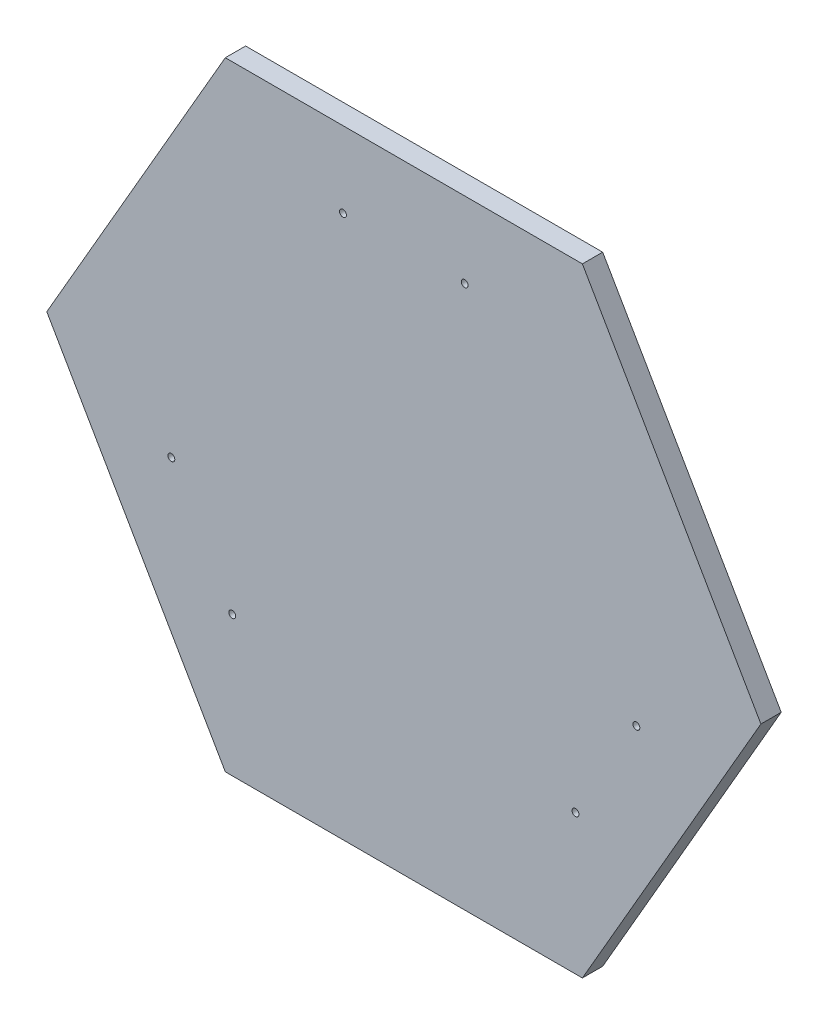
ISO-10303-21;
HEADER;
FILE_DESCRIPTION(('STEP AP214'),'2;1');
FILE_NAME('part.step','',(''),(''),'','','');
FILE_SCHEMA(('AUTOMOTIVE_DESIGN { 1 0 10303 214 1 1 1 1 }'));
ENDSEC;
DATA;
#1=APPLICATION_CONTEXT('core data for automotive mechanical design processes');
#2=APPLICATION_PROTOCOL_DEFINITION('international standard','automotive_design',2000,#1);
#3=PRODUCT_CONTEXT('',#1,'mechanical');
#4=PRODUCT('Part','Part','',(#3));
#5=PRODUCT_RELATED_PRODUCT_CATEGORY('part','',(#4));
#6=PRODUCT_DEFINITION_FORMATION('','',#4);
#7=PRODUCT_DEFINITION_CONTEXT('part definition',#1,'design');
#8=PRODUCT_DEFINITION('design','',#6,#7);
#9=PRODUCT_DEFINITION_SHAPE('','',#8);
#10=(LENGTH_UNIT() NAMED_UNIT(*) SI_UNIT(.MILLI.,.METRE.));
#11=(NAMED_UNIT(*) PLANE_ANGLE_UNIT() SI_UNIT($,.RADIAN.));
#12=(NAMED_UNIT(*) SI_UNIT($,.STERADIAN.) SOLID_ANGLE_UNIT());
#13=UNCERTAINTY_MEASURE_WITH_UNIT(LENGTH_MEASURE(1.E-05),#10,'distance_accuracy_value','');
#14=(GEOMETRIC_REPRESENTATION_CONTEXT(3) GLOBAL_UNCERTAINTY_ASSIGNED_CONTEXT((#13)) GLOBAL_UNIT_ASSIGNED_CONTEXT((#10,
#11,#12)) REPRESENTATION_CONTEXT('',''));
#15=CARTESIAN_POINT('',(0.,0.,0.));
#16=DIRECTION('',(0.,0.,1.));
#17=DIRECTION('',(1.,0.,0.));
#18=AXIS2_PLACEMENT_3D('',#15,#16,#17);
#19=CARTESIAN_POINT('',(87.988181024499,152.4,5.));
#20=DIRECTION('',(0.,-1.,0.));
#21=DIRECTION('',(0.,0.,-1.));
#22=AXIS2_PLACEMENT_3D('',#19,#20,#21);
#23=PLANE('',#22);
#24=DIRECTION('',(-1.,0.,0.));
#25=VECTOR('',#24,1.);
#26=CARTESIAN_POINT('',(87.988181024499,152.4,-5.));
#27=LINE('',#26,#25);
#28=CARTESIAN_POINT('',(87.988181024499,152.4,-5.));
#29=VERTEX_POINT('',#28);
#30=CARTESIAN_POINT('',(-87.9881810244989,152.4,-5.));
#31=VERTEX_POINT('',#30);
#32=EDGE_CURVE('E117',#29,#31,#27,.T.);
#33=ORIENTED_EDGE('',*,*,#32,.T.);
#34=DIRECTION('',(0.,0.,-1.));
#35=VECTOR('',#34,1.);
#36=CARTESIAN_POINT('',(-87.9881810244989,152.4,5.));
#37=LINE('',#36,#35);
#38=CARTESIAN_POINT('',(-87.9881810244989,152.4,5.));
#39=VERTEX_POINT('',#38);
#40=EDGE_CURVE('E11',#39,#31,#37,.T.);
#41=ORIENTED_EDGE('',*,*,#40,.F.);
#42=DIRECTION('',(-1.,0.,0.));
#43=VECTOR('',#42,1.);
#44=CARTESIAN_POINT('',(87.988181024499,152.4,5.));
#45=LINE('',#44,#43);
#46=CARTESIAN_POINT('',(87.988181024499,152.4,5.));
#47=VERTEX_POINT('',#46);
#48=EDGE_CURVE('E128',#47,#39,#45,.T.);
#49=ORIENTED_EDGE('',*,*,#48,.F.);
#50=DIRECTION('',(0.,0.,-1.));
#51=VECTOR('',#50,1.);
#52=CARTESIAN_POINT('',(87.988181024499,152.4,5.));
#53=LINE('',#52,#51);
#54=EDGE_CURVE('E113',#47,#29,#53,.T.);
#55=ORIENTED_EDGE('',*,*,#54,.T.);
#56=EDGE_LOOP('',(#33,#41,#49,#55));
#57=FACE_BOUND('',#56,.T.);
#58=ADVANCED_FACE('F33',(#57),#23,.F.);
#59=CARTESIAN_POINT('',(-87.9881810244989,152.4,5.));
#60=DIRECTION('',(0.866025403784439,-0.5,0.));
#61=DIRECTION('',(0.5,0.866025403784439,0.));
#62=AXIS2_PLACEMENT_3D('',#59,#60,#61);
#63=PLANE('',#62);
#64=DIRECTION('',(-0.5,-0.866025403784439,0.));
#65=VECTOR('',#64,1.);
#66=CARTESIAN_POINT('',(-87.9881810244989,152.4,-5.));
#67=LINE('',#66,#65);
#68=CARTESIAN_POINT('',(-175.976362048998,0.,-5.));
#69=VERTEX_POINT('',#68);
#70=EDGE_CURVE('E120',#31,#69,#67,.T.);
#71=ORIENTED_EDGE('',*,*,#70,.T.);
#72=DIRECTION('',(0.,0.,-1.));
#73=VECTOR('',#72,1.);
#74=CARTESIAN_POINT('',(-175.976362048998,0.,5.));
#75=LINE('',#74,#73);
#76=CARTESIAN_POINT('',(-175.976362048998,0.,5.));
#77=VERTEX_POINT('',#76);
#78=EDGE_CURVE('E41',#77,#69,#75,.T.);
#79=ORIENTED_EDGE('',*,*,#78,.F.);
#80=DIRECTION('',(-0.5,-0.866025403784439,0.));
#81=VECTOR('',#80,1.);
#82=CARTESIAN_POINT('',(-87.9881810244989,152.4,5.));
#83=LINE('',#82,#81);
#84=EDGE_CURVE('E86',#39,#77,#83,.T.);
#85=ORIENTED_EDGE('',*,*,#84,.F.);
#86=ORIENTED_EDGE('',*,*,#40,.T.);
#87=EDGE_LOOP('',(#71,#79,#85,#86));
#88=FACE_BOUND('',#87,.T.);
#89=ADVANCED_FACE('F153',(#88),#63,.F.);
#90=CARTESIAN_POINT('',(-175.976362048998,0.,5.));
#91=DIRECTION('',(0.866025403784439,0.5,0.));
#92=DIRECTION('',(-0.5,0.866025403784439,0.));
#93=AXIS2_PLACEMENT_3D('',#90,#91,#92);
#94=PLANE('',#93);
#95=DIRECTION('',(0.5,-0.866025403784439,0.));
#96=VECTOR('',#95,1.);
#97=CARTESIAN_POINT('',(-175.976362048998,0.,-5.));
#98=LINE('',#97,#96);
#99=CARTESIAN_POINT('',(-87.988181024499,-152.4,-5.));
#100=VERTEX_POINT('',#99);
#101=EDGE_CURVE('E123',#69,#100,#98,.T.);
#102=ORIENTED_EDGE('',*,*,#101,.T.);
#103=DIRECTION('',(0.,0.,-1.));
#104=VECTOR('',#103,1.);
#105=CARTESIAN_POINT('',(-87.988181024499,-152.4,5.));
#106=LINE('',#105,#104);
#107=CARTESIAN_POINT('',(-87.988181024499,-152.4,5.));
#108=VERTEX_POINT('',#107);
#109=EDGE_CURVE('E108',#108,#100,#106,.T.);
#110=ORIENTED_EDGE('',*,*,#109,.F.);
#111=DIRECTION('',(0.5,-0.866025403784439,0.));
#112=VECTOR('',#111,1.);
#113=CARTESIAN_POINT('',(-175.976362048998,0.,5.));
#114=LINE('',#113,#112);
#115=EDGE_CURVE('E99',#77,#108,#114,.T.);
#116=ORIENTED_EDGE('',*,*,#115,.F.);
#117=ORIENTED_EDGE('',*,*,#78,.T.);
#118=EDGE_LOOP('',(#102,#110,#116,#117));
#119=FACE_BOUND('',#118,.T.);
#120=ADVANCED_FACE('F134',(#119),#94,.F.);
#121=CARTESIAN_POINT('',(-87.988181024499,-152.4,5.));
#122=DIRECTION('',(0.,1.,0.));
#123=DIRECTION('',(-1.,0.,0.));
#124=AXIS2_PLACEMENT_3D('',#121,#122,#123);
#125=PLANE('',#124);
#126=DIRECTION('',(1.,0.,0.));
#127=VECTOR('',#126,1.);
#128=CARTESIAN_POINT('',(-87.988181024499,-152.4,-5.));
#129=LINE('',#128,#127);
#130=CARTESIAN_POINT('',(87.9881810244989,-152.4,-5.));
#131=VERTEX_POINT('',#130);
#132=EDGE_CURVE('E107',#100,#131,#129,.T.);
#133=ORIENTED_EDGE('',*,*,#132,.T.);
#134=DIRECTION('',(0.,0.,-1.));
#135=VECTOR('',#134,1.);
#136=CARTESIAN_POINT('',(87.9881810244989,-152.4,5.));
#137=LINE('',#136,#135);
#138=CARTESIAN_POINT('',(87.9881810244989,-152.4,5.));
#139=VERTEX_POINT('',#138);
#140=EDGE_CURVE('E104',#139,#131,#137,.T.);
#141=ORIENTED_EDGE('',*,*,#140,.F.);
#142=DIRECTION('',(1.,0.,0.));
#143=VECTOR('',#142,1.);
#144=CARTESIAN_POINT('',(-87.988181024499,-152.4,5.));
#145=LINE('',#144,#143);
#146=EDGE_CURVE('E93',#108,#139,#145,.T.);
#147=ORIENTED_EDGE('',*,*,#146,.F.);
#148=ORIENTED_EDGE('',*,*,#109,.T.);
#149=EDGE_LOOP('',(#133,#141,#147,#148));
#150=FACE_BOUND('',#149,.T.);
#151=ADVANCED_FACE('F105',(#150),#125,.F.);
#152=CARTESIAN_POINT('',(87.9881810244989,-152.4,5.));
#153=DIRECTION('',(-0.866025403784439,0.5,0.));
#154=DIRECTION('',(-0.5,-0.866025403784439,0.));
#155=AXIS2_PLACEMENT_3D('',#152,#153,#154);
#156=PLANE('',#155);
#157=DIRECTION('',(0.5,0.866025403784439,0.));
#158=VECTOR('',#157,1.);
#159=CARTESIAN_POINT('',(87.9881810244989,-152.4,-5.));
#160=LINE('',#159,#158);
#161=CARTESIAN_POINT('',(175.976362048998,0.,-5.));
#162=VERTEX_POINT('',#161);
#163=EDGE_CURVE('E72',#131,#162,#160,.T.);
#164=ORIENTED_EDGE('',*,*,#163,.T.);
#165=DIRECTION('',(0.,0.,-1.));
#166=VECTOR('',#165,1.);
#167=CARTESIAN_POINT('',(175.976362048998,0.,5.));
#168=LINE('',#167,#166);
#169=CARTESIAN_POINT('',(175.976362048998,0.,5.));
#170=VERTEX_POINT('',#169);
#171=EDGE_CURVE('E109',#170,#162,#168,.T.);
#172=ORIENTED_EDGE('',*,*,#171,.F.);
#173=DIRECTION('',(0.5,0.866025403784439,0.));
#174=VECTOR('',#173,1.);
#175=CARTESIAN_POINT('',(87.9881810244989,-152.4,5.));
#176=LINE('',#175,#174);
#177=EDGE_CURVE('E97',#139,#170,#176,.T.);
#178=ORIENTED_EDGE('',*,*,#177,.F.);
#179=ORIENTED_EDGE('',*,*,#140,.T.);
#180=EDGE_LOOP('',(#164,#172,#178,#179));
#181=FACE_BOUND('',#180,.T.);
#182=ADVANCED_FACE('F111',(#181),#156,.F.);
#183=CARTESIAN_POINT('',(175.976362048998,0.,5.));
#184=DIRECTION('',(-0.866025403784439,-0.5,0.));
#185=DIRECTION('',(0.5,-0.866025403784439,0.));
#186=AXIS2_PLACEMENT_3D('',#183,#184,#185);
#187=PLANE('',#186);
#188=DIRECTION('',(-0.5,0.866025403784439,0.));
#189=VECTOR('',#188,1.);
#190=CARTESIAN_POINT('',(175.976362048998,0.,-5.));
#191=LINE('',#190,#189);
#192=EDGE_CURVE('E78',#162,#29,#191,.T.);
#193=ORIENTED_EDGE('',*,*,#192,.T.);
#194=ORIENTED_EDGE('',*,*,#54,.F.);
#195=DIRECTION('',(-0.5,0.866025403784439,0.));
#196=VECTOR('',#195,1.);
#197=CARTESIAN_POINT('',(175.976362048998,0.,5.));
#198=LINE('',#197,#196);
#199=EDGE_CURVE('E49',#170,#47,#198,.T.);
#200=ORIENTED_EDGE('',*,*,#199,.F.);
#201=ORIENTED_EDGE('',*,*,#171,.T.);
#202=EDGE_LOOP('',(#193,#194,#200,#201));
#203=FACE_BOUND('',#202,.T.);
#204=ADVANCED_FACE('F141',(#203),#187,.F.);
#205=CARTESIAN_POINT('',(0.,0.,5.));
#206=DIRECTION('',(0.,0.,1.));
#207=DIRECTION('',(1.,0.,0.));
#208=AXIS2_PLACEMENT_3D('',#205,#206,#207);
#209=PLANE('',#208);
#210=CARTESIAN_POINT('',(114.59292143557,-31.5192378858634,5.));
#211=DIRECTION('',(0.,0.,1.));
#212=DIRECTION('',(1.,0.,0.));
#213=AXIS2_PLACEMENT_3D('',#210,#211,#212);
#214=CIRCLE('',#213,1.69999999999999);
#215=CARTESIAN_POINT('',(116.29292143557,-31.5192378858634,5.));
#216=VERTEX_POINT('',#215);
#217=EDGE_CURVE('E259',#216,#216,#214,.T.);
#218=ORIENTED_EDGE('',*,*,#217,.F.);
#219=EDGE_LOOP('',(#218));
#220=FACE_BOUND('',#219,.T.);
#221=CARTESIAN_POINT('',(84.5929214348677,-83.4807621141452,5.));
#222=DIRECTION('',(0.,0.,1.));
#223=DIRECTION('',(1.,0.,0.));
#224=AXIS2_PLACEMENT_3D('',#221,#222,#223);
#225=CIRCLE('',#224,1.69999999999999);
#226=CARTESIAN_POINT('',(86.2929214348677,-83.4807621141452,5.));
#227=VERTEX_POINT('',#226);
#228=EDGE_CURVE('E261',#227,#227,#225,.T.);
#229=ORIENTED_EDGE('',*,*,#228,.F.);
#230=EDGE_LOOP('',(#229));
#231=FACE_BOUND('',#230,.T.);
#232=CARTESIAN_POINT('',(-84.5929214348678,-83.4807621141455,5.));
#233=DIRECTION('',(0.,0.,1.));
#234=DIRECTION('',(1.,0.,0.));
#235=AXIS2_PLACEMENT_3D('',#232,#233,#234);
#236=CIRCLE('',#235,1.69999999999999);
#237=CARTESIAN_POINT('',(-82.8929214348678,-83.4807621141455,5.));
#238=VERTEX_POINT('',#237);
#239=EDGE_CURVE('E269',#238,#238,#236,.T.);
#240=ORIENTED_EDGE('',*,*,#239,.F.);
#241=EDGE_LOOP('',(#240));
#242=FACE_BOUND('',#241,.T.);
#243=CARTESIAN_POINT('',(-114.592921435569,-31.5192378858635,5.));
#244=DIRECTION('',(0.,0.,1.));
#245=DIRECTION('',(1.,0.,0.));
#246=AXIS2_PLACEMENT_3D('',#243,#244,#245);
#247=CIRCLE('',#246,1.69999999999999);
#248=CARTESIAN_POINT('',(-112.892921435569,-31.5192378858635,5.));
#249=VERTEX_POINT('',#248);
#250=EDGE_CURVE('E275',#249,#249,#247,.T.);
#251=ORIENTED_EDGE('',*,*,#250,.F.);
#252=EDGE_LOOP('',(#251));
#253=FACE_BOUND('',#252,.T.);
#254=CARTESIAN_POINT('',(-30.0000000007011,115.00000000001,5.));
#255=DIRECTION('',(0.,0.,1.));
#256=DIRECTION('',(1.,0.,0.));
#257=AXIS2_PLACEMENT_3D('',#254,#255,#256);
#258=CIRCLE('',#257,1.69999999999999);
#259=CARTESIAN_POINT('',(-28.3000000007011,115.00000000001,5.));
#260=VERTEX_POINT('',#259);
#261=EDGE_CURVE('E281',#260,#260,#258,.T.);
#262=ORIENTED_EDGE('',*,*,#261,.F.);
#263=EDGE_LOOP('',(#262));
#264=FACE_BOUND('',#263,.T.);
#265=CARTESIAN_POINT('',(30.0000000007025,115.000000000009,5.));
#266=DIRECTION('',(0.,0.,1.));
#267=DIRECTION('',(1.,0.,0.));
#268=AXIS2_PLACEMENT_3D('',#265,#266,#267);
#269=CIRCLE('',#268,1.69999999999999);
#270=CARTESIAN_POINT('',(31.7000000007025,115.000000000009,5.));
#271=VERTEX_POINT('',#270);
#272=EDGE_CURVE('E287',#271,#271,#269,.T.);
#273=ORIENTED_EDGE('',*,*,#272,.F.);
#274=EDGE_LOOP('',(#273));
#275=FACE_BOUND('',#274,.T.);
#276=ORIENTED_EDGE('',*,*,#48,.T.);
#277=ORIENTED_EDGE('',*,*,#84,.T.);
#278=ORIENTED_EDGE('',*,*,#115,.T.);
#279=ORIENTED_EDGE('',*,*,#146,.T.);
#280=ORIENTED_EDGE('',*,*,#177,.T.);
#281=ORIENTED_EDGE('',*,*,#199,.T.);
#282=EDGE_LOOP('',(#276,#277,#278,#279,#280,#281));
#283=FACE_BOUND('',#282,.T.);
#284=ADVANCED_FACE('F95',(#220,#231,#242,#253,#264,#275,#283),#209,.T.);
#285=CARTESIAN_POINT('',(0.,0.,-5.));
#286=DIRECTION('',(0.,0.,1.));
#287=DIRECTION('',(1.,0.,0.));
#288=AXIS2_PLACEMENT_3D('',#285,#286,#287);
#289=PLANE('',#288);
#290=CARTESIAN_POINT('',(114.59292143557,-31.5192378858634,-5.));
#291=DIRECTION('',(0.,0.,1.));
#292=DIRECTION('',(1.,0.,0.));
#293=AXIS2_PLACEMENT_3D('',#290,#291,#292);
#294=CIRCLE('',#293,1.69999999999999);
#295=CARTESIAN_POINT('',(116.29292143557,-31.5192378858634,-5.));
#296=VERTEX_POINT('',#295);
#297=EDGE_CURVE('E256',#296,#296,#294,.T.);
#298=ORIENTED_EDGE('',*,*,#297,.T.);
#299=EDGE_LOOP('',(#298));
#300=FACE_BOUND('',#299,.T.);
#301=CARTESIAN_POINT('',(84.5929214348677,-83.4807621141452,-5.));
#302=DIRECTION('',(0.,0.,1.));
#303=DIRECTION('',(1.,0.,0.));
#304=AXIS2_PLACEMENT_3D('',#301,#302,#303);
#305=CIRCLE('',#304,1.69999999999999);
#306=CARTESIAN_POINT('',(86.2929214348677,-83.4807621141452,-5.));
#307=VERTEX_POINT('',#306);
#308=EDGE_CURVE('E266',#307,#307,#305,.T.);
#309=ORIENTED_EDGE('',*,*,#308,.T.);
#310=EDGE_LOOP('',(#309));
#311=FACE_BOUND('',#310,.T.);
#312=CARTESIAN_POINT('',(-84.5929214348678,-83.4807621141455,-5.));
#313=DIRECTION('',(0.,0.,1.));
#314=DIRECTION('',(1.,0.,0.));
#315=AXIS2_PLACEMENT_3D('',#312,#313,#314);
#316=CIRCLE('',#315,1.69999999999999);
#317=CARTESIAN_POINT('',(-82.8929214348678,-83.4807621141455,-5.));
#318=VERTEX_POINT('',#317);
#319=EDGE_CURVE('E272',#318,#318,#316,.T.);
#320=ORIENTED_EDGE('',*,*,#319,.T.);
#321=EDGE_LOOP('',(#320));
#322=FACE_BOUND('',#321,.T.);
#323=CARTESIAN_POINT('',(-114.592921435569,-31.5192378858635,-5.));
#324=DIRECTION('',(0.,0.,1.));
#325=DIRECTION('',(1.,0.,0.));
#326=AXIS2_PLACEMENT_3D('',#323,#324,#325);
#327=CIRCLE('',#326,1.69999999999999);
#328=CARTESIAN_POINT('',(-112.892921435569,-31.5192378858635,-5.));
#329=VERTEX_POINT('',#328);
#330=EDGE_CURVE('E278',#329,#329,#327,.T.);
#331=ORIENTED_EDGE('',*,*,#330,.T.);
#332=EDGE_LOOP('',(#331));
#333=FACE_BOUND('',#332,.T.);
#334=CARTESIAN_POINT('',(-30.0000000007011,115.00000000001,-5.));
#335=DIRECTION('',(0.,0.,1.));
#336=DIRECTION('',(1.,0.,0.));
#337=AXIS2_PLACEMENT_3D('',#334,#335,#336);
#338=CIRCLE('',#337,1.7);
#339=CARTESIAN_POINT('',(-28.3000000007011,115.00000000001,-5.));
#340=VERTEX_POINT('',#339);
#341=EDGE_CURVE('E284',#340,#340,#338,.T.);
#342=ORIENTED_EDGE('',*,*,#341,.T.);
#343=EDGE_LOOP('',(#342));
#344=FACE_BOUND('',#343,.T.);
#345=CARTESIAN_POINT('',(30.0000000007025,115.000000000009,-5.));
#346=DIRECTION('',(0.,0.,1.));
#347=DIRECTION('',(1.,0.,0.));
#348=AXIS2_PLACEMENT_3D('',#345,#346,#347);
#349=CIRCLE('',#348,1.7);
#350=CARTESIAN_POINT('',(31.7000000007025,115.000000000009,-5.));
#351=VERTEX_POINT('',#350);
#352=EDGE_CURVE('E121',#351,#351,#349,.T.);
#353=ORIENTED_EDGE('',*,*,#352,.T.);
#354=EDGE_LOOP('',(#353));
#355=FACE_BOUND('',#354,.T.);
#356=ORIENTED_EDGE('',*,*,#32,.F.);
#357=ORIENTED_EDGE('',*,*,#192,.F.);
#358=ORIENTED_EDGE('',*,*,#163,.F.);
#359=ORIENTED_EDGE('',*,*,#132,.F.);
#360=ORIENTED_EDGE('',*,*,#101,.F.);
#361=ORIENTED_EDGE('',*,*,#70,.F.);
#362=EDGE_LOOP('',(#356,#357,#358,#359,#360,#361));
#363=FACE_BOUND('',#362,.T.);
#364=ADVANCED_FACE('F137',(#300,#311,#322,#333,#344,#355,#363),#289,.F.);
#365=CARTESIAN_POINT('',(30.0000000007025,115.000000000009,5.));
#366=DIRECTION('',(0.,0.,1.));
#367=DIRECTION('',(1.,0.,0.));
#368=AXIS2_PLACEMENT_3D('',#365,#366,#367);
#369=CYLINDRICAL_SURFACE('',#368,1.69999999999999);
#370=ORIENTED_EDGE('',*,*,#352,.F.);
#371=EDGE_LOOP('',(#370));
#372=FACE_BOUND('',#371,.T.);
#373=ORIENTED_EDGE('',*,*,#272,.T.);
#374=EDGE_LOOP('',(#373));
#375=FACE_BOUND('',#374,.T.);
#376=ADVANCED_FACE('F181',(#372,#375),#369,.F.);
#377=CARTESIAN_POINT('',(-30.0000000007011,115.00000000001,5.));
#378=DIRECTION('',(0.,0.,1.));
#379=DIRECTION('',(1.,0.,0.));
#380=AXIS2_PLACEMENT_3D('',#377,#378,#379);
#381=CYLINDRICAL_SURFACE('',#380,1.69999999999999);
#382=ORIENTED_EDGE('',*,*,#341,.F.);
#383=EDGE_LOOP('',(#382));
#384=FACE_BOUND('',#383,.T.);
#385=ORIENTED_EDGE('',*,*,#261,.T.);
#386=EDGE_LOOP('',(#385));
#387=FACE_BOUND('',#386,.T.);
#388=ADVANCED_FACE('F186',(#384,#387),#381,.F.);
#389=CARTESIAN_POINT('',(-114.592921435569,-31.5192378858635,5.));
#390=DIRECTION('',(0.,0.,1.));
#391=DIRECTION('',(1.,0.,0.));
#392=AXIS2_PLACEMENT_3D('',#389,#390,#391);
#393=CYLINDRICAL_SURFACE('',#392,1.69999999999999);
#394=ORIENTED_EDGE('',*,*,#330,.F.);
#395=EDGE_LOOP('',(#394));
#396=FACE_BOUND('',#395,.T.);
#397=ORIENTED_EDGE('',*,*,#250,.T.);
#398=EDGE_LOOP('',(#397));
#399=FACE_BOUND('',#398,.T.);
#400=ADVANCED_FACE('F198',(#396,#399),#393,.F.);
#401=CARTESIAN_POINT('',(-84.5929214348678,-83.4807621141455,5.));
#402=DIRECTION('',(0.,0.,1.));
#403=DIRECTION('',(1.,0.,0.));
#404=AXIS2_PLACEMENT_3D('',#401,#402,#403);
#405=CYLINDRICAL_SURFACE('',#404,1.69999999999999);
#406=ORIENTED_EDGE('',*,*,#319,.F.);
#407=EDGE_LOOP('',(#406));
#408=FACE_BOUND('',#407,.T.);
#409=ORIENTED_EDGE('',*,*,#239,.T.);
#410=EDGE_LOOP('',(#409));
#411=FACE_BOUND('',#410,.T.);
#412=ADVANCED_FACE('F219',(#408,#411),#405,.F.);
#413=CARTESIAN_POINT('',(84.5929214348677,-83.4807621141452,5.));
#414=DIRECTION('',(0.,0.,1.));
#415=DIRECTION('',(1.,0.,0.));
#416=AXIS2_PLACEMENT_3D('',#413,#414,#415);
#417=CYLINDRICAL_SURFACE('',#416,1.69999999999999);
#418=ORIENTED_EDGE('',*,*,#308,.F.);
#419=EDGE_LOOP('',(#418));
#420=FACE_BOUND('',#419,.T.);
#421=ORIENTED_EDGE('',*,*,#228,.T.);
#422=EDGE_LOOP('',(#421));
#423=FACE_BOUND('',#422,.T.);
#424=ADVANCED_FACE('F229',(#420,#423),#417,.F.);
#425=CARTESIAN_POINT('',(114.59292143557,-31.5192378858634,5.));
#426=DIRECTION('',(0.,0.,1.));
#427=DIRECTION('',(1.,0.,0.));
#428=AXIS2_PLACEMENT_3D('',#425,#426,#427);
#429=CYLINDRICAL_SURFACE('',#428,1.69999999999999);
#430=ORIENTED_EDGE('',*,*,#297,.F.);
#431=EDGE_LOOP('',(#430));
#432=FACE_BOUND('',#431,.T.);
#433=ORIENTED_EDGE('',*,*,#217,.T.);
#434=EDGE_LOOP('',(#433));
#435=FACE_BOUND('',#434,.T.);
#436=ADVANCED_FACE('F239',(#432,#435),#429,.F.);
#437=CLOSED_SHELL('',(#58,#89,#120,#151,#182,#204,#284,#364,#376,#388,#400,#412,#424,#436));
#438=MANIFOLD_SOLID_BREP('B2',#437);
#439=ADVANCED_BREP_SHAPE_REPRESENTATION('',(#18,#438),#14);
#440=SHAPE_DEFINITION_REPRESENTATION(#9,#439);
ENDSEC;
END-ISO-10303-21;
